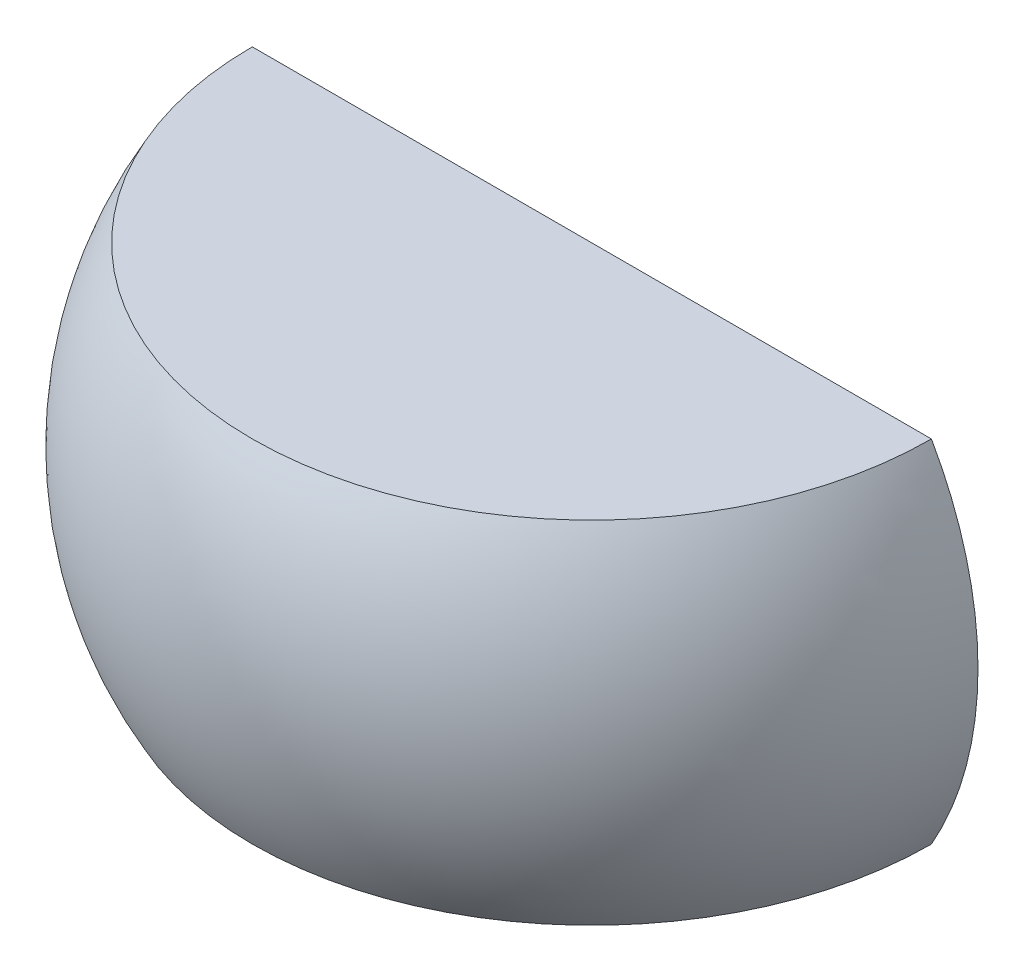
ISO-10303-21;
HEADER;
FILE_DESCRIPTION(('STEP AP214'),'2;1');
FILE_NAME('part.step','',(''),(''),'','','');
FILE_SCHEMA(('AUTOMOTIVE_DESIGN { 1 0 10303 214 1 1 1 1 }'));
ENDSEC;
DATA;
#1=APPLICATION_CONTEXT('core data for automotive mechanical design processes');
#2=APPLICATION_PROTOCOL_DEFINITION('international standard','automotive_design',2000,#1);
#3=PRODUCT_CONTEXT('',#1,'mechanical');
#4=PRODUCT('Part','Part','',(#3));
#5=PRODUCT_RELATED_PRODUCT_CATEGORY('part','',(#4));
#6=PRODUCT_DEFINITION_FORMATION('','',#4);
#7=PRODUCT_DEFINITION_CONTEXT('part definition',#1,'design');
#8=PRODUCT_DEFINITION('design','',#6,#7);
#9=PRODUCT_DEFINITION_SHAPE('','',#8);
#10=(LENGTH_UNIT() NAMED_UNIT(*) SI_UNIT(.MILLI.,.METRE.));
#11=(NAMED_UNIT(*) PLANE_ANGLE_UNIT() SI_UNIT($,.RADIAN.));
#12=(NAMED_UNIT(*) SI_UNIT($,.STERADIAN.) SOLID_ANGLE_UNIT());
#13=UNCERTAINTY_MEASURE_WITH_UNIT(LENGTH_MEASURE(1.E-05),#10,'distance_accuracy_value','');
#14=(GEOMETRIC_REPRESENTATION_CONTEXT(3) GLOBAL_UNCERTAINTY_ASSIGNED_CONTEXT((#13)) GLOBAL_UNIT_ASSIGNED_CONTEXT((#10,
#11,#12)) REPRESENTATION_CONTEXT('',''));
#15=CARTESIAN_POINT('',(0.,0.,0.));
#16=DIRECTION('',(0.,0.,1.));
#17=DIRECTION('',(1.,0.,0.));
#18=AXIS2_PLACEMENT_3D('',#15,#16,#17);
#19=CARTESIAN_POINT('',(-29.2821669392394,6.51678059773895,0.));
#20=DIRECTION('',(0.,-1.,0.));
#21=DIRECTION('',(0.,0.,-1.));
#22=AXIS2_PLACEMENT_3D('',#19,#20,#21);
#23=DEGENERATE_TOROIDAL_SURFACE('',#22,0.00103214813353819,25.,.T.);
#24=CARTESIAN_POINT('',(-29.2821669392394,17.4161588185678,0.));
#25=DIRECTION('',(0.,-1.,0.));
#26=DIRECTION('',(0.,0.,-1.));
#27=AXIS2_PLACEMENT_3D('',#24,#25,#26);
#28=CIRCLE('',#27,22.5);
#29=CARTESIAN_POINT('',(-6.78216693923943,17.4161588185678,-1.57116660247941E-13));
#30=VERTEX_POINT('',#29);
#31=CARTESIAN_POINT('',(-51.7821669392394,17.4161588185678,0.));
#32=VERTEX_POINT('',#31);
#33=EDGE_CURVE('E11',#30,#32,#28,.T.);
#34=ORIENTED_EDGE('',*,*,#33,.F.);
#35=CARTESIAN_POINT('',(-29.2811347911059,6.51678059773895,0.));
#36=DIRECTION('',(0.,0.,1.));
#37=DIRECTION('',(-1.,0.,0.));
#38=AXIS2_PLACEMENT_3D('',#35,#36,#37);
#39=CIRCLE('',#38,25.);
#40=CARTESIAN_POINT('',(-6.78216693923943,-4.38259762308996,-1.57116660247941E-13));
#41=VERTEX_POINT('',#40);
#42=EDGE_CURVE('E249',#41,#30,#39,.T.);
#43=ORIENTED_EDGE('',*,*,#42,.F.);
#44=CARTESIAN_POINT('',(-29.2821669392394,-4.38259762308996,0.));
#45=DIRECTION('',(0.,-1.,0.));
#46=DIRECTION('',(0.,0.,-1.));
#47=AXIS2_PLACEMENT_3D('',#44,#45,#46);
#48=CIRCLE('',#47,22.5);
#49=CARTESIAN_POINT('',(-51.7821669392394,-4.38259762308996,0.));
#50=VERTEX_POINT('',#49);
#51=EDGE_CURVE('E274',#41,#50,#48,.T.);
#52=ORIENTED_EDGE('',*,*,#51,.T.);
#53=CARTESIAN_POINT('',(-29.283199087373,6.51678059773895,0.));
#54=DIRECTION('',(0.,0.,-1.));
#55=DIRECTION('',(1.,0.,0.));
#56=AXIS2_PLACEMENT_3D('',#53,#54,#55);
#57=CIRCLE('',#56,25.);
#58=EDGE_CURVE('E228',#50,#32,#57,.T.);
#59=ORIENTED_EDGE('',*,*,#58,.T.);
#60=EDGE_LOOP('',(#34,#43,#52,#59));
#61=FACE_BOUND('',#60,.T.);
#62=ADVANCED_FACE('F33',(#61),#23,.F.);
#63=CARTESIAN_POINT('',(-6.78216693923943,17.4161588185678,-1.57116660247941E-13));
#64=DIRECTION('',(0.,1.,0.));
#65=DIRECTION('',(0.,0.,1.));
#66=AXIS2_PLACEMENT_3D('',#63,#64,#65);
#67=PLANE('',#66);
#68=ORIENTED_EDGE('',*,*,#33,.T.);
#69=DIRECTION('',(-1.,0.,0.));
#70=VECTOR('',#69,1.);
#71=CARTESIAN_POINT('',(-6.78216693923943,17.4161588185678,-1.57116660247941E-13));
#72=LINE('',#71,#70);
#73=EDGE_CURVE('E252',#30,#32,#72,.T.);
#74=ORIENTED_EDGE('',*,*,#73,.F.);
#75=EDGE_LOOP('',(#68,#74));
#76=FACE_BOUND('',#75,.T.);
#77=ADVANCED_FACE('F35',(#76),#67,.F.);
#78=CARTESIAN_POINT('',(-29.2821669392394,18.9161588185678,0.));
#79=DIRECTION('',(0.,-1.,0.));
#80=DIRECTION('',(0.,0.,-1.));
#81=AXIS2_PLACEMENT_3D('',#78,#79,#80);
#82=PLANE('',#81);
#83=CARTESIAN_POINT('',(-29.2821669392394,18.9161588185678,0.));
#84=DIRECTION('',(0.,-1.,0.));
#85=DIRECTION('',(0.,0.,-1.));
#86=AXIS2_PLACEMENT_3D('',#83,#84,#85);
#87=CIRCLE('',#86,24.);
#88=CARTESIAN_POINT('',(-5.28216693923943,18.9161588185678,-1.6759110426447E-13));
#89=VERTEX_POINT('',#88);
#90=CARTESIAN_POINT('',(-53.2821669392394,18.9161588185678,0.));
#91=VERTEX_POINT('',#90);
#92=EDGE_CURVE('E41',#89,#91,#87,.T.);
#93=ORIENTED_EDGE('',*,*,#92,.F.);
#94=DIRECTION('',(1.,0.,0.));
#95=VECTOR('',#94,1.);
#96=CARTESIAN_POINT('',(-29.2821669392394,18.9161588185678,0.));
#97=LINE('',#96,#95);
#98=EDGE_CURVE('E254',#91,#89,#97,.T.);
#99=ORIENTED_EDGE('',*,*,#98,.F.);
#100=EDGE_LOOP('',(#93,#99));
#101=FACE_BOUND('',#100,.T.);
#102=ADVANCED_FACE('F329',(#101),#82,.F.);
#103=CARTESIAN_POINT('',(-29.2821669392394,6.51678059773893,0.));
#104=DIRECTION('',(0.,-1.,0.));
#105=DIRECTION('',(0.,0.,-1.));
#106=AXIS2_PLACEMENT_3D('',#103,#104,#105);
#107=DEGENERATE_TOROIDAL_SURFACE('',#106,2.29158182324576,25.,.T.);
#108=CARTESIAN_POINT('',(-29.2821669392394,-5.88259762308999,0.));
#109=DIRECTION('',(0.,-1.,0.));
#110=DIRECTION('',(0.,0.,-1.));
#111=AXIS2_PLACEMENT_3D('',#108,#109,#110);
#112=CIRCLE('',#111,24.);
#113=CARTESIAN_POINT('',(-5.28216693923943,-5.88259762308999,-1.6759110426447E-13));
#114=VERTEX_POINT('',#113);
#115=CARTESIAN_POINT('',(-53.2821669392394,-5.88259762308999,0.));
#116=VERTEX_POINT('',#115);
#117=EDGE_CURVE('E286',#114,#116,#112,.T.);
#118=ORIENTED_EDGE('',*,*,#117,.F.);
#119=CARTESIAN_POINT('',(-26.9905851159937,6.51678059773893,0.));
#120=DIRECTION('',(0.,0.,-1.));
#121=DIRECTION('',(1.,0.,0.));
#122=AXIS2_PLACEMENT_3D('',#119,#120,#121);
#123=CIRCLE('',#122,25.);
#124=EDGE_CURVE('E257',#89,#114,#123,.T.);
#125=ORIENTED_EDGE('',*,*,#124,.F.);
#126=ORIENTED_EDGE('',*,*,#92,.T.);
#127=CARTESIAN_POINT('',(-31.5737487624852,6.51678059773893,0.));
#128=DIRECTION('',(0.,0.,1.));
#129=DIRECTION('',(-1.,0.,0.));
#130=AXIS2_PLACEMENT_3D('',#127,#128,#129);
#131=CIRCLE('',#130,25.);
#132=EDGE_CURVE('E231',#91,#116,#131,.T.);
#133=ORIENTED_EDGE('',*,*,#132,.T.);
#134=EDGE_LOOP('',(#118,#125,#126,#133));
#135=FACE_BOUND('',#134,.T.);
#136=ADVANCED_FACE('F291',(#135),#107,.T.);
#137=CARTESIAN_POINT('',(-15.3157907048612,-5.88259762308999,0.));
#138=DIRECTION('',(0.,1.,0.));
#139=DIRECTION('',(0.,0.,1.));
#140=AXIS2_PLACEMENT_3D('',#137,#138,#139);
#141=PLANE('',#140);
#142=DIRECTION('',(-1.,0.,0.));
#143=VECTOR('',#142,1.);
#144=CARTESIAN_POINT('',(-25.9821669392394,-5.88259762308994,4.78314037999894));
#145=LINE('',#144,#143);
#146=CARTESIAN_POINT('',(-25.9821669392394,-5.88259762308994,4.78314037999894));
#147=VERTEX_POINT('',#146);
#148=CARTESIAN_POINT('',(-32.5821669392395,-5.88259762308994,4.78314037999894));
#149=VERTEX_POINT('',#148);
#150=EDGE_CURVE('E201',#147,#149,#145,.T.);
#151=ORIENTED_EDGE('',*,*,#150,.F.);
#152=DIRECTION('',(0.,0.,-1.));
#153=VECTOR('',#152,1.);
#154=CARTESIAN_POINT('',(-25.9821669392394,-5.88259762308996,15.));
#155=LINE('',#154,#153);
#156=CARTESIAN_POINT('',(-25.9821669392394,-5.88259762308996,0.));
#157=VERTEX_POINT('',#156);
#158=EDGE_CURVE('E208',#147,#157,#155,.T.);
#159=ORIENTED_EDGE('',*,*,#158,.T.);
#160=DIRECTION('',(1.,0.,0.));
#161=VECTOR('',#160,1.);
#162=CARTESIAN_POINT('',(-23.9821669392394,-5.88259762308996,0.));
#163=LINE('',#162,#161);
#164=CARTESIAN_POINT('',(-23.9821669392394,-5.88259762308996,0.));
#165=VERTEX_POINT('',#164);
#166=EDGE_CURVE('E219',#157,#165,#163,.T.);
#167=ORIENTED_EDGE('',*,*,#166,.T.);
#168=DIRECTION('',(0.,0.,-1.));
#169=VECTOR('',#168,1.);
#170=CARTESIAN_POINT('',(-23.9821669392394,-5.88259762308996,15.));
#171=LINE('',#170,#169);
#172=CARTESIAN_POINT('',(-23.9821669392394,-5.88259762308996,5.32971966399045));
#173=VERTEX_POINT('',#172);
#174=EDGE_CURVE('E217',#173,#165,#171,.T.);
#175=ORIENTED_EDGE('',*,*,#174,.F.);
#176=CARTESIAN_POINT('',(-29.2821669392394,-5.88259762308999,0.));
#177=DIRECTION('',(0.,-1.,0.));
#178=DIRECTION('',(0.,0.,-1.));
#179=AXIS2_PLACEMENT_3D('',#176,#177,#178);
#180=CIRCLE('',#179,7.51637623437827);
#181=CARTESIAN_POINT('',(-21.7657907048612,-5.88259762308999,0.));
#182=VERTEX_POINT('',#181);
#183=EDGE_CURVE('E283',#182,#173,#180,.T.);
#184=ORIENTED_EDGE('',*,*,#183,.F.);
#185=DIRECTION('',(-1.,0.,0.));
#186=VECTOR('',#185,1.);
#187=CARTESIAN_POINT('',(-5.28216693923943,-5.88259762308999,-1.6759110426447E-13));
#188=LINE('',#187,#186);
#189=EDGE_CURVE('E260',#114,#182,#188,.T.);
#190=ORIENTED_EDGE('',*,*,#189,.F.);
#191=ORIENTED_EDGE('',*,*,#117,.T.);
#192=DIRECTION('',(1.,0.,0.));
#193=VECTOR('',#192,1.);
#194=CARTESIAN_POINT('',(-53.2821669392394,-5.88259762308999,0.));
#195=LINE('',#194,#193);
#196=CARTESIAN_POINT('',(-36.7985431736177,-5.88259762308999,0.));
#197=VERTEX_POINT('',#196);
#198=EDGE_CURVE('E234',#116,#197,#195,.T.);
#199=ORIENTED_EDGE('',*,*,#198,.T.);
#200=CARTESIAN_POINT('',(-34.5821669392394,-5.88259762308996,5.32971966399045));
#201=VERTEX_POINT('',#200);
#202=EDGE_CURVE('E282',#201,#197,#180,.T.);
#203=ORIENTED_EDGE('',*,*,#202,.F.);
#204=DIRECTION('',(0.,0.,-1.));
#205=VECTOR('',#204,1.);
#206=CARTESIAN_POINT('',(-34.5821669392394,-5.88259762308996,15.));
#207=LINE('',#206,#205);
#208=CARTESIAN_POINT('',(-34.5821669392394,-5.88259762308996,0.));
#209=VERTEX_POINT('',#208);
#210=EDGE_CURVE('E613',#201,#209,#207,.T.);
#211=ORIENTED_EDGE('',*,*,#210,.T.);
#212=DIRECTION('',(1.,0.,0.));
#213=VECTOR('',#212,1.);
#214=CARTESIAN_POINT('',(-32.5821669392394,-5.88259762308996,0.));
#215=LINE('',#214,#213);
#216=CARTESIAN_POINT('',(-32.5821669392394,-5.88259762308996,0.));
#217=VERTEX_POINT('',#216);
#218=EDGE_CURVE('E606',#209,#217,#215,.T.);
#219=ORIENTED_EDGE('',*,*,#218,.T.);
#220=DIRECTION('',(0.,0.,-1.));
#221=VECTOR('',#220,1.);
#222=CARTESIAN_POINT('',(-32.5821669392394,-5.88259762308996,15.));
#223=LINE('',#222,#221);
#224=EDGE_CURVE('E610',#149,#217,#223,.T.);
#225=ORIENTED_EDGE('',*,*,#224,.F.);
#226=EDGE_LOOP('',(#151,#159,#167,#175,#184,#190,#191,#199,#203,#211,#219,#225));
#227=FACE_BOUND('',#226,.T.);
#228=ADVANCED_FACE('F300',(#227),#141,.F.);
#229=CARTESIAN_POINT('',(-29.2821669392394,17.4161588185679,0.));
#230=DIRECTION('',(0.,-1.,0.));
#231=DIRECTION('',(0.,0.,-1.));
#232=AXIS2_PLACEMENT_3D('',#229,#230,#231);
#233=CYLINDRICAL_SURFACE('',#232,7.51637623437827);
#234=CARTESIAN_POINT('',(-29.2821669392394,-9.88259762308996,0.));
#235=DIRECTION('',(0.,1.,0.));
#236=DIRECTION('',(0.,0.,1.));
#237=AXIS2_PLACEMENT_3D('',#234,#235,#236);
#238=CIRCLE('',#237,7.51637623437827);
#239=CARTESIAN_POINT('',(-34.5821669392395,-9.88259762308996,5.3297196639904));
#240=VERTEX_POINT('',#239);
#241=CARTESIAN_POINT('',(-23.9821669392395,-9.88259762308996,5.32971966399049));
#242=VERTEX_POINT('',#241);
#243=EDGE_CURVE('E595',#240,#242,#238,.T.);
#244=ORIENTED_EDGE('',*,*,#243,.T.);
#245=DIRECTION('',(0.,-1.,0.));
#246=VECTOR('',#245,1.);
#247=CARTESIAN_POINT('',(-23.9821669392394,17.4161588185678,5.32971966399046));
#248=LINE('',#247,#246);
#249=CARTESIAN_POINT('',(-23.9821669392395,-12.88259762309,5.32971966399049));
#250=VERTEX_POINT('',#249);
#251=EDGE_CURVE('E649',#242,#250,#248,.T.);
#252=ORIENTED_EDGE('',*,*,#251,.T.);
#253=CARTESIAN_POINT('',(-29.2821669392394,-12.8825976230899,0.));
#254=DIRECTION('',(0.,-1.,0.));
#255=DIRECTION('',(0.,0.,-1.));
#256=AXIS2_PLACEMENT_3D('',#253,#254,#255);
#257=CIRCLE('',#256,7.51637623437827);
#258=CARTESIAN_POINT('',(-34.5821669392395,-12.8825976230899,5.3297196639904));
#259=VERTEX_POINT('',#258);
#260=EDGE_CURVE('E588',#250,#259,#257,.T.);
#261=ORIENTED_EDGE('',*,*,#260,.T.);
#262=DIRECTION('',(0.,-1.,0.));
#263=VECTOR('',#262,1.);
#264=CARTESIAN_POINT('',(-34.5821669392395,17.4161588185679,5.3297196639904));
#265=LINE('',#264,#263);
#266=EDGE_CURVE('E591',#259,#240,#265,.F.);
#267=ORIENTED_EDGE('',*,*,#266,.T.);
#268=EDGE_LOOP('',(#244,#252,#261,#267));
#269=FACE_BOUND('',#268,.T.);
#270=CARTESIAN_POINT('',(-29.2821669392394,-8.88259762308995,0.));
#271=DIRECTION('',(0.,-1.,0.));
#272=DIRECTION('',(0.,0.,-1.));
#273=AXIS2_PLACEMENT_3D('',#270,#271,#272);
#274=CIRCLE('',#273,7.51637623437827);
#275=CARTESIAN_POINT('',(-23.9821669392394,-8.88259762308995,5.32971966399045));
#276=VERTEX_POINT('',#275);
#277=CARTESIAN_POINT('',(-34.5821669392394,-8.88259762308995,5.32971966399045));
#278=VERTEX_POINT('',#277);
#279=EDGE_CURVE('E223',#276,#278,#274,.T.);
#280=ORIENTED_EDGE('',*,*,#279,.T.);
#281=DIRECTION('',(0.,-1.,0.));
#282=VECTOR('',#281,1.);
#283=CARTESIAN_POINT('',(-34.5821669392394,17.4161588185679,5.32971966399045));
#284=LINE('',#283,#282);
#285=EDGE_CURVE('E612',#278,#201,#284,.F.);
#286=ORIENTED_EDGE('',*,*,#285,.T.);
#287=ORIENTED_EDGE('',*,*,#202,.T.);
#288=DIRECTION('',(0.,-1.,0.));
#289=VECTOR('',#288,1.);
#290=CARTESIAN_POINT('',(-36.7985431736177,-5.88259762308999,0.));
#291=LINE('',#290,#289);
#292=CARTESIAN_POINT('',(-36.7985431736177,-13.9561743791705,0.));
#293=VERTEX_POINT('',#292);
#294=EDGE_CURVE('E237',#197,#293,#291,.T.);
#295=ORIENTED_EDGE('',*,*,#294,.T.);
#296=CARTESIAN_POINT('',(-29.2821669392394,-13.9561743791705,0.));
#297=DIRECTION('',(0.,-1.,0.));
#298=DIRECTION('',(0.,0.,-1.));
#299=AXIS2_PLACEMENT_3D('',#296,#297,#298);
#300=CIRCLE('',#299,7.51637623437827);
#301=CARTESIAN_POINT('',(-21.7657907048612,-13.9561743791705,0.));
#302=VERTEX_POINT('',#301);
#303=EDGE_CURVE('E280',#302,#293,#300,.T.);
#304=ORIENTED_EDGE('',*,*,#303,.F.);
#305=DIRECTION('',(0.,-1.,0.));
#306=VECTOR('',#305,1.);
#307=CARTESIAN_POINT('',(-21.7657907048612,-5.88259762308999,0.));
#308=LINE('',#307,#306);
#309=EDGE_CURVE('E262',#182,#302,#308,.T.);
#310=ORIENTED_EDGE('',*,*,#309,.F.);
#311=ORIENTED_EDGE('',*,*,#183,.T.);
#312=DIRECTION('',(0.,-1.,0.));
#313=VECTOR('',#312,1.);
#314=CARTESIAN_POINT('',(-23.9821669392394,17.4161588185678,5.32971966399042));
#315=LINE('',#314,#313);
#316=EDGE_CURVE('E225',#173,#276,#315,.T.);
#317=ORIENTED_EDGE('',*,*,#316,.T.);
#318=EDGE_LOOP('',(#280,#286,#287,#295,#304,#310,#311,#317));
#319=FACE_BOUND('',#318,.T.);
#320=ADVANCED_FACE('F308',(#269,#319),#233,.T.);
#321=CARTESIAN_POINT('',(-29.2821669392394,-13.9561743791705,0.));
#322=DIRECTION('',(0.,1.,0.));
#323=DIRECTION('',(0.,0.,1.));
#324=AXIS2_PLACEMENT_3D('',#321,#322,#323);
#325=CONICAL_SURFACE('',#324,7.51637623437827,0.71478301696537);
#326=CARTESIAN_POINT('',(-29.2821669392394,-19.9666572926056,0.));
#327=DIRECTION('',(0.,-1.,0.));
#328=DIRECTION('',(0.,0.,-1.));
#329=AXIS2_PLACEMENT_3D('',#326,#327,#328);
#330=CIRCLE('',#329,2.3);
#331=CARTESIAN_POINT('',(-26.9821669392394,-19.9666572926056,0.));
#332=VERTEX_POINT('',#331);
#333=CARTESIAN_POINT('',(-31.5821669392394,-19.9666572926056,0.));
#334=VERTEX_POINT('',#333);
#335=EDGE_CURVE('E278',#332,#334,#330,.T.);
#336=ORIENTED_EDGE('',*,*,#335,.F.);
#337=DIRECTION('',(-0.655453558841748,-0.755235481291555,0.));
#338=VECTOR('',#337,1.);
#339=CARTESIAN_POINT('',(-21.7657907048612,-13.9561743791705,0.));
#340=LINE('',#339,#338);
#341=EDGE_CURVE('E265',#302,#332,#340,.T.);
#342=ORIENTED_EDGE('',*,*,#341,.F.);
#343=ORIENTED_EDGE('',*,*,#303,.T.);
#344=DIRECTION('',(0.655453558841748,-0.755235481291555,0.));
#345=VECTOR('',#344,1.);
#346=CARTESIAN_POINT('',(-36.7985431736177,-13.9561743791705,0.));
#347=LINE('',#346,#345);
#348=EDGE_CURVE('E240',#293,#334,#347,.T.);
#349=ORIENTED_EDGE('',*,*,#348,.T.);
#350=EDGE_LOOP('',(#336,#342,#343,#349));
#351=FACE_BOUND('',#350,.T.);
#352=ADVANCED_FACE('F310',(#351),#325,.T.);
#353=CARTESIAN_POINT('',(-29.2821669392394,17.4161588185679,0.));
#354=DIRECTION('',(0.,-1.,0.));
#355=DIRECTION('',(0.,0.,-1.));
#356=AXIS2_PLACEMENT_3D('',#353,#354,#355);
#357=CYLINDRICAL_SURFACE('',#356,2.3);
#358=CARTESIAN_POINT('',(-29.2821669392394,-4.38259762308996,0.));
#359=DIRECTION('',(0.,-1.,0.));
#360=DIRECTION('',(0.,0.,-1.));
#361=AXIS2_PLACEMENT_3D('',#358,#359,#360);
#362=CIRCLE('',#361,2.3);
#363=CARTESIAN_POINT('',(-26.9821669392394,-4.38259762308996,0.));
#364=VERTEX_POINT('',#363);
#365=CARTESIAN_POINT('',(-31.5821669392394,-4.38259762308996,0.));
#366=VERTEX_POINT('',#365);
#367=EDGE_CURVE('E276',#364,#366,#362,.T.);
#368=ORIENTED_EDGE('',*,*,#367,.F.);
#369=DIRECTION('',(0.,1.,0.));
#370=VECTOR('',#369,1.);
#371=CARTESIAN_POINT('',(-26.9821669392394,-4.38259762308996,0.));
#372=LINE('',#371,#370);
#373=EDGE_CURVE('E268',#332,#364,#372,.T.);
#374=ORIENTED_EDGE('',*,*,#373,.F.);
#375=ORIENTED_EDGE('',*,*,#335,.T.);
#376=DIRECTION('',(0.,1.,0.));
#377=VECTOR('',#376,1.);
#378=CARTESIAN_POINT('',(-31.5821669392394,-4.38259762308996,0.));
#379=LINE('',#378,#377);
#380=EDGE_CURVE('E243',#334,#366,#379,.T.);
#381=ORIENTED_EDGE('',*,*,#380,.T.);
#382=EDGE_LOOP('',(#368,#374,#375,#381));
#383=FACE_BOUND('',#382,.T.);
#384=ADVANCED_FACE('F315',(#383),#357,.F.);
#385=CARTESIAN_POINT('',(-6.78216693923943,-4.38259762308996,-1.57116660247941E-13));
#386=DIRECTION('',(0.,-1.,0.));
#387=DIRECTION('',(0.,0.,-1.));
#388=AXIS2_PLACEMENT_3D('',#385,#386,#387);
#389=PLANE('',#388);
#390=DIRECTION('',(1.,0.,0.));
#391=VECTOR('',#390,1.);
#392=CARTESIAN_POINT('',(-6.78216693923943,-4.38259762308996,-1.57116660247941E-13));
#393=LINE('',#392,#391);
#394=EDGE_CURVE('E271',#364,#41,#393,.T.);
#395=ORIENTED_EDGE('',*,*,#394,.F.);
#396=ORIENTED_EDGE('',*,*,#367,.T.);
#397=DIRECTION('',(-1.,0.,0.));
#398=VECTOR('',#397,1.);
#399=CARTESIAN_POINT('',(-51.7821669392394,-4.38259762308996,0.));
#400=LINE('',#399,#398);
#401=EDGE_CURVE('E246',#366,#50,#400,.T.);
#402=ORIENTED_EDGE('',*,*,#401,.T.);
#403=ORIENTED_EDGE('',*,*,#51,.F.);
#404=EDGE_LOOP('',(#395,#396,#402,#403));
#405=FACE_BOUND('',#404,.T.);
#406=ADVANCED_FACE('F318',(#405),#389,.F.);
#407=CARTESIAN_POINT('',(-29.2811347911059,6.51678059773895,0.));
#408=DIRECTION('',(0.,0.,-1.));
#409=DIRECTION('',(-1.,0.,0.));
#410=AXIS2_PLACEMENT_3D('',#407,#408,#409);
#411=PLANE('',#410);
#412=DIRECTION('',(0.,-1.,0.));
#413=VECTOR('',#412,1.);
#414=CARTESIAN_POINT('',(-23.9821669392395,-9.88259762308996,0.));
#415=LINE('',#414,#413);
#416=CARTESIAN_POINT('',(-23.9821669392395,-9.88259762308996,0.));
#417=VERTEX_POINT('',#416);
#418=CARTESIAN_POINT('',(-23.9821669392395,-12.88259762309,0.));
#419=VERTEX_POINT('',#418);
#420=EDGE_CURVE('E56',#417,#419,#415,.T.);
#421=ORIENTED_EDGE('',*,*,#420,.F.);
#422=DIRECTION('',(1.,0.,0.));
#423=VECTOR('',#422,1.);
#424=CARTESIAN_POINT('',(-23.9821669392395,-9.88259762308996,0.));
#425=LINE('',#424,#423);
#426=CARTESIAN_POINT('',(-25.9821669392395,-9.88259762308996,0.));
#427=VERTEX_POINT('',#426);
#428=EDGE_CURVE('E643',#427,#417,#425,.T.);
#429=ORIENTED_EDGE('',*,*,#428,.F.);
#430=DIRECTION('',(0.,1.,0.));
#431=VECTOR('',#430,1.);
#432=CARTESIAN_POINT('',(-25.9821669392395,-9.88259762308996,0.));
#433=LINE('',#432,#431);
#434=CARTESIAN_POINT('',(-25.9821669392395,-12.88259762309,0.));
#435=VERTEX_POINT('',#434);
#436=EDGE_CURVE('E640',#435,#427,#433,.T.);
#437=ORIENTED_EDGE('',*,*,#436,.F.);
#438=DIRECTION('',(-1.,0.,0.));
#439=VECTOR('',#438,1.);
#440=CARTESIAN_POINT('',(-23.9821669392395,-12.88259762309,0.));
#441=LINE('',#440,#439);
#442=EDGE_CURVE('E637',#419,#435,#441,.T.);
#443=ORIENTED_EDGE('',*,*,#442,.F.);
#444=EDGE_LOOP('',(#421,#429,#437,#443));
#445=FACE_BOUND('',#444,.T.);
#446=DIRECTION('',(0.,-1.,0.));
#447=VECTOR('',#446,1.);
#448=CARTESIAN_POINT('',(-32.5821669392395,-9.88259762308996,0.));
#449=LINE('',#448,#447);
#450=CARTESIAN_POINT('',(-32.5821669392395,-9.88259762308996,0.));
#451=VERTEX_POINT('',#450);
#452=CARTESIAN_POINT('',(-32.5821669392395,-12.88259762309,0.));
#453=VERTEX_POINT('',#452);
#454=EDGE_CURVE('E575',#451,#453,#449,.T.);
#455=ORIENTED_EDGE('',*,*,#454,.F.);
#456=DIRECTION('',(1.,0.,0.));
#457=VECTOR('',#456,1.);
#458=CARTESIAN_POINT('',(-32.5821669392395,-9.88259762308996,0.));
#459=LINE('',#458,#457);
#460=CARTESIAN_POINT('',(-34.5821669392395,-9.88259762308996,0.));
#461=VERTEX_POINT('',#460);
#462=EDGE_CURVE('E579',#461,#451,#459,.T.);
#463=ORIENTED_EDGE('',*,*,#462,.F.);
#464=DIRECTION('',(0.,1.,0.));
#465=VECTOR('',#464,1.);
#466=CARTESIAN_POINT('',(-34.5821669392395,-9.88259762308996,0.));
#467=LINE('',#466,#465);
#468=CARTESIAN_POINT('',(-34.5821669392395,-12.8825976230899,0.));
#469=VERTEX_POINT('',#468);
#470=EDGE_CURVE('E584',#469,#461,#467,.T.);
#471=ORIENTED_EDGE('',*,*,#470,.F.);
#472=DIRECTION('',(-1.,0.,0.));
#473=VECTOR('',#472,1.);
#474=CARTESIAN_POINT('',(-32.5821669392395,-12.8825976230899,0.));
#475=LINE('',#474,#473);
#476=EDGE_CURVE('E658',#453,#469,#475,.T.);
#477=ORIENTED_EDGE('',*,*,#476,.F.);
#478=EDGE_LOOP('',(#455,#463,#471,#477));
#479=FACE_BOUND('',#478,.T.);
#480=DIRECTION('',(0.,-1.,0.));
#481=VECTOR('',#480,1.);
#482=CARTESIAN_POINT('',(-32.5821669392394,-5.88259762308996,0.));
#483=LINE('',#482,#481);
#484=CARTESIAN_POINT('',(-32.5821669392394,-8.88259762308995,0.));
#485=VERTEX_POINT('',#484);
#486=EDGE_CURVE('E597',#217,#485,#483,.T.);
#487=ORIENTED_EDGE('',*,*,#486,.F.);
#488=ORIENTED_EDGE('',*,*,#218,.F.);
#489=DIRECTION('',(0.,1.,0.));
#490=VECTOR('',#489,1.);
#491=CARTESIAN_POINT('',(-34.5821669392394,-5.88259762308996,0.));
#492=LINE('',#491,#490);
#493=CARTESIAN_POINT('',(-34.5821669392394,-8.88259762308995,0.));
#494=VERTEX_POINT('',#493);
#495=EDGE_CURVE('E603',#494,#209,#492,.T.);
#496=ORIENTED_EDGE('',*,*,#495,.F.);
#497=DIRECTION('',(-1.,0.,0.));
#498=VECTOR('',#497,1.);
#499=CARTESIAN_POINT('',(-32.5821669392394,-8.88259762308995,0.));
#500=LINE('',#499,#498);
#501=EDGE_CURVE('E600',#485,#494,#500,.T.);
#502=ORIENTED_EDGE('',*,*,#501,.F.);
#503=EDGE_LOOP('',(#487,#488,#496,#502));
#504=FACE_BOUND('',#503,.T.);
#505=DIRECTION('',(0.,-1.,0.));
#506=VECTOR('',#505,1.);
#507=CARTESIAN_POINT('',(-23.9821669392394,-5.88259762308996,0.));
#508=LINE('',#507,#506);
#509=CARTESIAN_POINT('',(-23.9821669392394,-8.88259762308995,0.));
#510=VERTEX_POINT('',#509);
#511=EDGE_CURVE('E620',#165,#510,#508,.T.);
#512=ORIENTED_EDGE('',*,*,#511,.F.);
#513=ORIENTED_EDGE('',*,*,#166,.F.);
#514=DIRECTION('',(0.,1.,0.));
#515=VECTOR('',#514,1.);
#516=CARTESIAN_POINT('',(-25.9821669392394,-5.88259762308996,0.));
#517=LINE('',#516,#515);
#518=CARTESIAN_POINT('',(-25.9821669392394,-8.88259762308995,0.));
#519=VERTEX_POINT('',#518);
#520=EDGE_CURVE('E623',#519,#157,#517,.T.);
#521=ORIENTED_EDGE('',*,*,#520,.F.);
#522=DIRECTION('',(-1.,0.,0.));
#523=VECTOR('',#522,1.);
#524=CARTESIAN_POINT('',(-23.9821669392394,-8.88259762308995,0.));
#525=LINE('',#524,#523);
#526=EDGE_CURVE('E213',#510,#519,#525,.T.);
#527=ORIENTED_EDGE('',*,*,#526,.F.);
#528=EDGE_LOOP('',(#512,#513,#521,#527));
#529=FACE_BOUND('',#528,.T.);
#530=ORIENTED_EDGE('',*,*,#42,.T.);
#531=ORIENTED_EDGE('',*,*,#73,.T.);
#532=ORIENTED_EDGE('',*,*,#58,.F.);
#533=ORIENTED_EDGE('',*,*,#401,.F.);
#534=ORIENTED_EDGE('',*,*,#380,.F.);
#535=ORIENTED_EDGE('',*,*,#348,.F.);
#536=ORIENTED_EDGE('',*,*,#294,.F.);
#537=ORIENTED_EDGE('',*,*,#198,.F.);
#538=ORIENTED_EDGE('',*,*,#132,.F.);
#539=ORIENTED_EDGE('',*,*,#98,.T.);
#540=ORIENTED_EDGE('',*,*,#124,.T.);
#541=ORIENTED_EDGE('',*,*,#189,.T.);
#542=ORIENTED_EDGE('',*,*,#309,.T.);
#543=ORIENTED_EDGE('',*,*,#341,.T.);
#544=ORIENTED_EDGE('',*,*,#373,.T.);
#545=ORIENTED_EDGE('',*,*,#394,.T.);
#546=EDGE_LOOP('',(#530,#531,#532,#533,#534,#535,#536,#537,#538,#539,#540,#541,#542,#543,#544,#545));
#547=FACE_BOUND('',#546,.T.);
#548=ADVANCED_FACE('F295',(#445,#479,#504,#529,#547),#411,.T.);
#549=CARTESIAN_POINT('',(-23.9821669392394,-5.88259762308996,15.));
#550=DIRECTION('',(1.,0.,0.));
#551=DIRECTION('',(0.,1.,0.));
#552=AXIS2_PLACEMENT_3D('',#549,#550,#551);
#553=PLANE('',#552);
#554=ORIENTED_EDGE('',*,*,#174,.T.);
#555=ORIENTED_EDGE('',*,*,#511,.T.);
#556=DIRECTION('',(0.,0.,-1.));
#557=VECTOR('',#556,1.);
#558=CARTESIAN_POINT('',(-23.9821669392394,-8.88259762308995,15.));
#559=LINE('',#558,#557);
#560=EDGE_CURVE('E215',#276,#510,#559,.T.);
#561=ORIENTED_EDGE('',*,*,#560,.F.);
#562=ORIENTED_EDGE('',*,*,#316,.F.);
#563=EDGE_LOOP('',(#554,#555,#561,#562));
#564=FACE_BOUND('',#563,.T.);
#565=ADVANCED_FACE('F382',(#564),#553,.F.);
#566=CARTESIAN_POINT('',(-25.9821669392394,-5.88259762308996,15.));
#567=DIRECTION('',(-1.,0.,0.));
#568=DIRECTION('',(0.,0.,1.));
#569=AXIS2_PLACEMENT_3D('',#566,#567,#568);
#570=PLANE('',#569);
#571=ORIENTED_EDGE('',*,*,#158,.F.);
#572=DIRECTION('',(0.,-1.,0.));
#573=VECTOR('',#572,1.);
#574=CARTESIAN_POINT('',(-25.9821669392394,-8.88259762308996,4.78314037999894));
#575=LINE('',#574,#573);
#576=CARTESIAN_POINT('',(-25.9821669392394,-8.88259762308996,4.78314037999894));
#577=VERTEX_POINT('',#576);
#578=EDGE_CURVE('E196',#147,#577,#575,.T.);
#579=ORIENTED_EDGE('',*,*,#578,.T.);
#580=DIRECTION('',(0.,0.,-1.));
#581=VECTOR('',#580,1.);
#582=CARTESIAN_POINT('',(-25.9821669392394,-8.88259762308995,15.));
#583=LINE('',#582,#581);
#584=EDGE_CURVE('E206',#577,#519,#583,.T.);
#585=ORIENTED_EDGE('',*,*,#584,.T.);
#586=ORIENTED_EDGE('',*,*,#520,.T.);
#587=EDGE_LOOP('',(#571,#579,#585,#586));
#588=FACE_BOUND('',#587,.T.);
#589=ADVANCED_FACE('F204',(#588),#570,.F.);
#590=CARTESIAN_POINT('',(-23.9821669392394,-8.88259762308995,15.));
#591=DIRECTION('',(0.,-1.,0.));
#592=DIRECTION('',(0.,0.,-1.));
#593=AXIS2_PLACEMENT_3D('',#590,#591,#592);
#594=PLANE('',#593);
#595=ORIENTED_EDGE('',*,*,#560,.T.);
#596=ORIENTED_EDGE('',*,*,#526,.T.);
#597=ORIENTED_EDGE('',*,*,#584,.F.);
#598=DIRECTION('',(-1.,0.,0.));
#599=VECTOR('',#598,1.);
#600=CARTESIAN_POINT('',(-25.9821669392394,-8.88259762308996,4.78314037999894));
#601=LINE('',#600,#599);
#602=CARTESIAN_POINT('',(-32.5821669392394,-8.88259762308995,4.78314037999894));
#603=VERTEX_POINT('',#602);
#604=EDGE_CURVE('E193',#577,#603,#601,.T.);
#605=ORIENTED_EDGE('',*,*,#604,.T.);
#606=DIRECTION('',(0.,0.,-1.));
#607=VECTOR('',#606,1.);
#608=CARTESIAN_POINT('',(-32.5821669392394,-8.88259762308995,15.));
#609=LINE('',#608,#607);
#610=EDGE_CURVE('E609',#603,#485,#609,.T.);
#611=ORIENTED_EDGE('',*,*,#610,.T.);
#612=ORIENTED_EDGE('',*,*,#501,.T.);
#613=DIRECTION('',(0.,0.,-1.));
#614=VECTOR('',#613,1.);
#615=CARTESIAN_POINT('',(-34.5821669392394,-8.88259762308995,15.));
#616=LINE('',#615,#614);
#617=EDGE_CURVE('E615',#278,#494,#616,.T.);
#618=ORIENTED_EDGE('',*,*,#617,.F.);
#619=ORIENTED_EDGE('',*,*,#279,.F.);
#620=EDGE_LOOP('',(#595,#596,#597,#605,#611,#612,#618,#619));
#621=FACE_BOUND('',#620,.T.);
#622=ADVANCED_FACE('F211',(#621),#594,.F.);
#623=CARTESIAN_POINT('',(-32.5821669392394,-5.88259762308996,15.));
#624=DIRECTION('',(1.,0.,0.));
#625=DIRECTION('',(0.,0.,-1.));
#626=AXIS2_PLACEMENT_3D('',#623,#624,#625);
#627=PLANE('',#626);
#628=ORIENTED_EDGE('',*,*,#610,.F.);
#629=DIRECTION('',(0.,-1.,0.));
#630=VECTOR('',#629,1.);
#631=CARTESIAN_POINT('',(-32.5821669392395,-8.88259762308996,4.78314037999894));
#632=LINE('',#631,#630);
#633=EDGE_CURVE('E48',#149,#603,#632,.T.);
#634=ORIENTED_EDGE('',*,*,#633,.F.);
#635=ORIENTED_EDGE('',*,*,#224,.T.);
#636=ORIENTED_EDGE('',*,*,#486,.T.);
#637=EDGE_LOOP('',(#628,#634,#635,#636));
#638=FACE_BOUND('',#637,.T.);
#639=ADVANCED_FACE('F401',(#638),#627,.F.);
#640=CARTESIAN_POINT('',(-34.5821669392394,-5.88259762308996,15.));
#641=DIRECTION('',(-1.,0.,0.));
#642=DIRECTION('',(0.,0.,1.));
#643=AXIS2_PLACEMENT_3D('',#640,#641,#642);
#644=PLANE('',#643);
#645=ORIENTED_EDGE('',*,*,#617,.T.);
#646=ORIENTED_EDGE('',*,*,#495,.T.);
#647=ORIENTED_EDGE('',*,*,#210,.F.);
#648=ORIENTED_EDGE('',*,*,#285,.F.);
#649=EDGE_LOOP('',(#645,#646,#647,#648));
#650=FACE_BOUND('',#649,.T.);
#651=ADVANCED_FACE('F408',(#650),#644,.F.);
#652=CARTESIAN_POINT('',(-32.5821669392395,-9.88259762308996,15.));
#653=DIRECTION('',(1.,0.,0.));
#654=DIRECTION('',(0.,0.,-1.));
#655=AXIS2_PLACEMENT_3D('',#652,#653,#654);
#656=PLANE('',#655);
#657=DIRECTION('',(0.,0.,-1.));
#658=VECTOR('',#657,1.);
#659=CARTESIAN_POINT('',(-32.5821669392395,-12.8825976230899,15.));
#660=LINE('',#659,#658);
#661=CARTESIAN_POINT('',(-32.5821669392395,-12.88259762309,4.78314037999894));
#662=VERTEX_POINT('',#661);
#663=EDGE_CURVE('E573',#662,#453,#660,.T.);
#664=ORIENTED_EDGE('',*,*,#663,.F.);
#665=DIRECTION('',(0.,-1.,0.));
#666=VECTOR('',#665,1.);
#667=CARTESIAN_POINT('',(-32.5821669392395,-12.88259762309,4.78314037999894));
#668=LINE('',#667,#666);
#669=CARTESIAN_POINT('',(-32.5821669392395,-9.88259762308996,4.78314037999894));
#670=VERTEX_POINT('',#669);
#671=EDGE_CURVE('E563',#670,#662,#668,.T.);
#672=ORIENTED_EDGE('',*,*,#671,.F.);
#673=DIRECTION('',(0.,0.,-1.));
#674=VECTOR('',#673,1.);
#675=CARTESIAN_POINT('',(-32.5821669392395,-9.88259762308996,15.));
#676=LINE('',#675,#674);
#677=EDGE_CURVE('E592',#670,#451,#676,.T.);
#678=ORIENTED_EDGE('',*,*,#677,.T.);
#679=ORIENTED_EDGE('',*,*,#454,.T.);
#680=EDGE_LOOP('',(#664,#672,#678,#679));
#681=FACE_BOUND('',#680,.T.);
#682=ADVANCED_FACE('F416',(#681),#656,.F.);
#683=CARTESIAN_POINT('',(-32.5821669392395,-9.88259762308996,15.));
#684=DIRECTION('',(0.,1.,0.));
#685=DIRECTION('',(0.,0.,1.));
#686=AXIS2_PLACEMENT_3D('',#683,#684,#685);
#687=PLANE('',#686);
#688=DIRECTION('',(0.,0.,-1.));
#689=VECTOR('',#688,1.);
#690=CARTESIAN_POINT('',(-34.5821669392395,-9.88259762308996,15.));
#691=LINE('',#690,#689);
#692=EDGE_CURVE('E581',#240,#461,#691,.T.);
#693=ORIENTED_EDGE('',*,*,#692,.T.);
#694=ORIENTED_EDGE('',*,*,#462,.T.);
#695=ORIENTED_EDGE('',*,*,#677,.F.);
#696=DIRECTION('',(-1.,0.,0.));
#697=VECTOR('',#696,1.);
#698=CARTESIAN_POINT('',(-25.9821669392394,-9.88259762308996,4.78314037999894));
#699=LINE('',#698,#697);
#700=CARTESIAN_POINT('',(-25.9821669392394,-9.88259762308996,4.78314037999894));
#701=VERTEX_POINT('',#700);
#702=EDGE_CURVE('E568',#701,#670,#699,.T.);
#703=ORIENTED_EDGE('',*,*,#702,.F.);
#704=DIRECTION('',(0.,0.,-1.));
#705=VECTOR('',#704,1.);
#706=CARTESIAN_POINT('',(-25.9821669392395,-9.88259762308996,15.));
#707=LINE('',#706,#705);
#708=EDGE_CURVE('E650',#701,#427,#707,.T.);
#709=ORIENTED_EDGE('',*,*,#708,.T.);
#710=ORIENTED_EDGE('',*,*,#428,.T.);
#711=DIRECTION('',(0.,0.,-1.));
#712=VECTOR('',#711,1.);
#713=CARTESIAN_POINT('',(-23.9821669392395,-9.88259762308996,15.));
#714=LINE('',#713,#712);
#715=EDGE_CURVE('E647',#242,#417,#714,.T.);
#716=ORIENTED_EDGE('',*,*,#715,.F.);
#717=ORIENTED_EDGE('',*,*,#243,.F.);
#718=EDGE_LOOP('',(#693,#694,#695,#703,#709,#710,#716,#717));
#719=FACE_BOUND('',#718,.T.);
#720=ADVANCED_FACE('F424',(#719),#687,.F.);
#721=CARTESIAN_POINT('',(-34.5821669392395,-9.88259762308996,15.));
#722=DIRECTION('',(-1.,0.,0.));
#723=DIRECTION('',(0.,0.,1.));
#724=AXIS2_PLACEMENT_3D('',#721,#722,#723);
#725=PLANE('',#724);
#726=DIRECTION('',(0.,0.,-1.));
#727=VECTOR('',#726,1.);
#728=CARTESIAN_POINT('',(-34.5821669392395,-12.8825976230899,15.));
#729=LINE('',#728,#727);
#730=EDGE_CURVE('E578',#259,#469,#729,.T.);
#731=ORIENTED_EDGE('',*,*,#730,.T.);
#732=ORIENTED_EDGE('',*,*,#470,.T.);
#733=ORIENTED_EDGE('',*,*,#692,.F.);
#734=ORIENTED_EDGE('',*,*,#266,.F.);
#735=EDGE_LOOP('',(#731,#732,#733,#734));
#736=FACE_BOUND('',#735,.T.);
#737=ADVANCED_FACE('F432',(#736),#725,.F.);
#738=CARTESIAN_POINT('',(-32.5821669392395,-12.8825976230899,15.));
#739=DIRECTION('',(0.,-1.,0.));
#740=DIRECTION('',(0.,0.,-1.));
#741=AXIS2_PLACEMENT_3D('',#738,#739,#740);
#742=PLANE('',#741);
#743=ORIENTED_EDGE('',*,*,#260,.F.);
#744=DIRECTION('',(0.,0.,-1.));
#745=VECTOR('',#744,1.);
#746=CARTESIAN_POINT('',(-23.9821669392395,-12.88259762309,15.));
#747=LINE('',#746,#745);
#748=EDGE_CURVE('E646',#250,#419,#747,.T.);
#749=ORIENTED_EDGE('',*,*,#748,.T.);
#750=ORIENTED_EDGE('',*,*,#442,.T.);
#751=DIRECTION('',(0.,0.,-1.));
#752=VECTOR('',#751,1.);
#753=CARTESIAN_POINT('',(-25.9821669392395,-12.88259762309,15.));
#754=LINE('',#753,#752);
#755=CARTESIAN_POINT('',(-25.9821669392394,-12.88259762309,4.78314037999894));
#756=VERTEX_POINT('',#755);
#757=EDGE_CURVE('E652',#756,#435,#754,.T.);
#758=ORIENTED_EDGE('',*,*,#757,.F.);
#759=DIRECTION('',(-1.,0.,0.));
#760=VECTOR('',#759,1.);
#761=CARTESIAN_POINT('',(-25.9821669392394,-12.88259762309,4.78314037999894));
#762=LINE('',#761,#760);
#763=EDGE_CURVE('E566',#756,#662,#762,.T.);
#764=ORIENTED_EDGE('',*,*,#763,.T.);
#765=ORIENTED_EDGE('',*,*,#663,.T.);
#766=ORIENTED_EDGE('',*,*,#476,.T.);
#767=ORIENTED_EDGE('',*,*,#730,.F.);
#768=EDGE_LOOP('',(#743,#749,#750,#758,#764,#765,#766,#767));
#769=FACE_BOUND('',#768,.T.);
#770=ADVANCED_FACE('F440',(#769),#742,.F.);
#771=CARTESIAN_POINT('',(-23.9821669392395,-9.88259762308996,15.));
#772=DIRECTION('',(1.,0.,0.));
#773=DIRECTION('',(0.,1.,0.));
#774=AXIS2_PLACEMENT_3D('',#771,#772,#773);
#775=PLANE('',#774);
#776=ORIENTED_EDGE('',*,*,#715,.T.);
#777=ORIENTED_EDGE('',*,*,#420,.T.);
#778=ORIENTED_EDGE('',*,*,#748,.F.);
#779=ORIENTED_EDGE('',*,*,#251,.F.);
#780=EDGE_LOOP('',(#776,#777,#778,#779));
#781=FACE_BOUND('',#780,.T.);
#782=ADVANCED_FACE('F447',(#781),#775,.F.);
#783=CARTESIAN_POINT('',(-25.9821669392395,-9.88259762308996,15.));
#784=DIRECTION('',(-1.,0.,0.));
#785=DIRECTION('',(0.,0.,1.));
#786=AXIS2_PLACEMENT_3D('',#783,#784,#785);
#787=PLANE('',#786);
#788=ORIENTED_EDGE('',*,*,#708,.F.);
#789=DIRECTION('',(0.,-1.,0.));
#790=VECTOR('',#789,1.);
#791=CARTESIAN_POINT('',(-25.9821669392394,-12.88259762309,4.78314037999894));
#792=LINE('',#791,#790);
#793=EDGE_CURVE('E570',#701,#756,#792,.T.);
#794=ORIENTED_EDGE('',*,*,#793,.T.);
#795=ORIENTED_EDGE('',*,*,#757,.T.);
#796=ORIENTED_EDGE('',*,*,#436,.T.);
#797=EDGE_LOOP('',(#788,#794,#795,#796));
#798=FACE_BOUND('',#797,.T.);
#799=ADVANCED_FACE('F455',(#798),#787,.F.);
#800=CARTESIAN_POINT('',(-25.9821669392394,-12.88259762309,4.78314037999894));
#801=DIRECTION('',(0.,0.,-1.));
#802=DIRECTION('',(-1.,0.,0.));
#803=AXIS2_PLACEMENT_3D('',#800,#801,#802);
#804=PLANE('',#803);
#805=ORIENTED_EDGE('',*,*,#671,.T.);
#806=ORIENTED_EDGE('',*,*,#763,.F.);
#807=ORIENTED_EDGE('',*,*,#793,.F.);
#808=ORIENTED_EDGE('',*,*,#702,.T.);
#809=EDGE_LOOP('',(#805,#806,#807,#808));
#810=FACE_BOUND('',#809,.T.);
#811=ADVANCED_FACE('F461',(#810),#804,.F.);
#812=CARTESIAN_POINT('',(-25.9821669392394,-8.88259762308996,4.78314037999894));
#813=DIRECTION('',(0.,0.,-1.));
#814=DIRECTION('',(-1.,0.,0.));
#815=AXIS2_PLACEMENT_3D('',#812,#813,#814);
#816=PLANE('',#815);
#817=ORIENTED_EDGE('',*,*,#633,.T.);
#818=ORIENTED_EDGE('',*,*,#604,.F.);
#819=ORIENTED_EDGE('',*,*,#578,.F.);
#820=ORIENTED_EDGE('',*,*,#150,.T.);
#821=EDGE_LOOP('',(#817,#818,#819,#820));
#822=FACE_BOUND('',#821,.T.);
#823=ADVANCED_FACE('F195',(#822),#816,.F.);
#824=CLOSED_SHELL('',(#62,#77,#102,#136,#228,#320,#352,#384,#406,#548,#565,#589,#622,#639,#651,
#682,#720,#737,#770,#782,#799,#811,#823));
#825=MANIFOLD_SOLID_BREP('B2',#824);
#826=ADVANCED_BREP_SHAPE_REPRESENTATION('',(#18,#825),#14);
#827=SHAPE_DEFINITION_REPRESENTATION(#9,#826);
ENDSEC;
END-ISO-10303-21;
